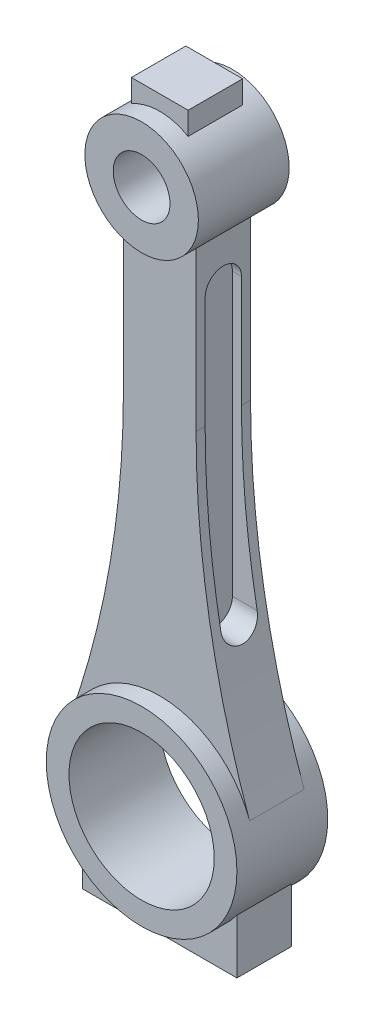
ISO-10303-21;
HEADER;
FILE_DESCRIPTION(('STEP AP214'),'2;1');
FILE_NAME('part.step','',(''),(''),'','','');
FILE_SCHEMA(('AUTOMOTIVE_DESIGN { 1 0 10303 214 1 1 1 1 }'));
ENDSEC;
DATA;
#1=APPLICATION_CONTEXT('core data for automotive mechanical design processes');
#2=APPLICATION_PROTOCOL_DEFINITION('international standard','automotive_design',2000,#1);
#3=PRODUCT_CONTEXT('',#1,'mechanical');
#4=PRODUCT('Part','Part','',(#3));
#5=PRODUCT_RELATED_PRODUCT_CATEGORY('part','',(#4));
#6=PRODUCT_DEFINITION_FORMATION('','',#4);
#7=PRODUCT_DEFINITION_CONTEXT('part definition',#1,'design');
#8=PRODUCT_DEFINITION('design','',#6,#7);
#9=PRODUCT_DEFINITION_SHAPE('','',#8);
#10=(LENGTH_UNIT() NAMED_UNIT(*) SI_UNIT(.MILLI.,.METRE.));
#11=(NAMED_UNIT(*) PLANE_ANGLE_UNIT() SI_UNIT($,.RADIAN.));
#12=(NAMED_UNIT(*) SI_UNIT($,.STERADIAN.) SOLID_ANGLE_UNIT());
#13=UNCERTAINTY_MEASURE_WITH_UNIT(LENGTH_MEASURE(1.E-05),#10,'distance_accuracy_value','');
#14=(GEOMETRIC_REPRESENTATION_CONTEXT(3) GLOBAL_UNCERTAINTY_ASSIGNED_CONTEXT((#13)) GLOBAL_UNIT_ASSIGNED_CONTEXT((#10,
#11,#12)) REPRESENTATION_CONTEXT('',''));
#15=CARTESIAN_POINT('',(0.,0.,0.));
#16=DIRECTION('',(0.,0.,1.));
#17=DIRECTION('',(1.,0.,0.));
#18=AXIS2_PLACEMENT_3D('',#15,#16,#17);
#19=CARTESIAN_POINT('',(212.132819979023,75.3953136438507,6.));
#20=DIRECTION('',(0.,0.,-1.));
#21=DIRECTION('',(-1.,0.,0.));
#22=AXIS2_PLACEMENT_3D('',#19,#20,#21);
#23=CYLINDRICAL_SURFACE('',#22,204.132819979023);
#24=CARTESIAN_POINT('',(11.4544735884215,38.,-4.00000000000002));
#25=CARTESIAN_POINT('',(11.4757515518411,37.8858086335559,-4.00000967356237));
#26=CARTESIAN_POINT('',(11.497127848932,37.7716411229782,-3.9951101211208));
#27=CARTESIAN_POINT('',(11.5399210356049,37.544152772884,-3.97557755361705));
#28=CARTESIAN_POINT('',(11.5613379239584,37.4308319082382,-3.9609448286138));
#29=CARTESIAN_POINT('',(11.6040518019029,37.2058589467753,-3.92203609087539));
#30=CARTESIAN_POINT('',(11.6253488219803,37.0942064124742,-3.89776265395078));
#31=CARTESIAN_POINT('',(11.6676599337569,36.8733657612217,-3.83975872762631));
#32=CARTESIAN_POINT('',(11.688674029376,36.7641776101131,-3.80602836938937));
#33=CARTESIAN_POINT('',(11.7510730473327,36.4413470108117,-3.69089420326939));
#34=CARTESIAN_POINT('',(11.7918289081029,36.2323636826891,-3.59553432969808));
#35=CARTESIAN_POINT('',(11.8702126062764,35.833491871712,-3.37027556179514));
#36=CARTESIAN_POINT('',(11.9078413597511,35.643597793309,-3.24038682968163));
#37=CARTESIAN_POINT('',(11.9784728244352,35.2894796680367,-2.95043691024401));
#38=CARTESIAN_POINT('',(12.0115036519545,35.1250988255321,-2.79057453802656));
#39=CARTESIAN_POINT('',(12.0720036427706,34.8256035029566,-2.44449926104125));
#40=CARTESIAN_POINT('',(12.0994724370194,34.6904909648341,-2.25828460915734));
#41=CARTESIAN_POINT('',(12.1473413477104,34.4559602912754,-1.86832249559897));
#42=CARTESIAN_POINT('',(12.1678582991115,34.3559510460777,-1.66494499104502));
#43=CARTESIAN_POINT('',(12.201667760202,34.1915558050773,-1.24372237948289));
#44=CARTESIAN_POINT('',(12.2149615713729,34.1271633917176,-1.02587988675161));
#45=CARTESIAN_POINT('',(12.2336033492388,34.0369591960168,-0.586274812122712));
#46=CARTESIAN_POINT('',(12.2390950212482,34.0104496060439,-0.364661335561861));
#47=CARTESIAN_POINT('',(12.2423732155319,33.9946184843632,0.0799443502249376));
#48=CARTESIAN_POINT('',(12.2401601145853,34.0052951341723,0.302936491499032));
#49=CARTESIAN_POINT('',(12.2281765408433,34.0632127244266,0.741781925824313));
#50=CARTESIAN_POINT('',(12.2184766498272,34.1101121767816,0.9576823655757));
#51=CARTESIAN_POINT('',(12.1919895794175,34.2385791029979,1.37844153266758));
#52=CARTESIAN_POINT('',(12.1752023313577,34.3201469127454,1.58330015300714));
#53=CARTESIAN_POINT('',(12.1350793834178,34.5159552856904,1.977397761575));
#54=CARTESIAN_POINT('',(12.1117098081664,34.6303649264094,2.16654921549123));
#55=CARTESIAN_POINT('',(12.0593260749273,34.8882465100265,2.52297125984127));
#56=CARTESIAN_POINT('',(12.0303117725959,35.0317191961119,2.69024129055298));
#57=CARTESIAN_POINT('',(11.9671383735568,35.3461665633751,3.00114206510914));
#58=CARTESIAN_POINT('',(11.9329025496515,35.5175545383741,3.14433904981939));
#59=CARTESIAN_POINT('',(11.8607975408038,35.8812712267655,3.40006280722765));
#60=CARTESIAN_POINT('',(11.8229268395298,36.0736086840292,3.51257670427656));
#61=CARTESIAN_POINT('',(11.7440110469991,36.4777513253325,3.70593438635491));
#62=CARTESIAN_POINT('',(11.7029182624971,36.6898643551292,3.78611370956408));
#63=CARTESIAN_POINT('',(11.619535719839,37.1241795414682,3.90944320644274));
#64=CARTESIAN_POINT('',(11.5772477716993,37.3463667203578,3.95264656840454));
#65=CARTESIAN_POINT('',(11.5215540274853,37.6417241762258,3.98457340087694));
#66=CARTESIAN_POINT('',(11.5080944382149,37.713314753212,3.99036111817268));
#67=CARTESIAN_POINT('',(11.4812368188341,37.8565916807734,3.99806924003836));
#68=CARTESIAN_POINT('',(11.467838723541,37.9282776734255,3.99999606757804));
#69=CARTESIAN_POINT('',(11.4544735884215,38.,3.99999999999999));
#70=B_SPLINE_CURVE_WITH_KNOTS('',3,(#24,#25,#26,#27,#28,#29,#30,#31,#32,#33,#34,#35,#36,#37,#38,
#39,#40,#41,#42,#43,#44,#45,#46,#47,#48,#49,#50,#51,#52,#53,#54,#55,#56,#57,#58,#59,#60,#61,#62,
#63,#64,#65,#66,#67,#68,#69),.UNSPECIFIED.,.F.,.F.,(4,2,2,2,2,2,2,2,2,2,2,2,2,2,2,2,2,2,2,2,2,2,
4),(0.,0.348357600629775,0.696704820295753,1.04495903090802,1.39320841164155,2.08947857427321,
2.78554404346984,3.47714614167073,4.1687941135383,4.84816302804556,5.52740949173436,
6.19397531687089,6.86050854603356,7.52083364695975,8.18116514562694,8.84495910470898,
9.50877004017902,10.183492218261,10.8584970981523,11.546741507572,12.2339942357506,
12.4531452672714,12.6719314158043),.UNSPECIFIED.);
#71=CARTESIAN_POINT('',(11.4544735884216,38.,-4.00000000000001));
#72=VERTEX_POINT('',#71);
#73=CARTESIAN_POINT('',(11.4544735884215,38.,3.99999999999999));
#74=VERTEX_POINT('',#73);
#75=EDGE_CURVE('E406',#72,#74,#70,.T.);
#76=ORIENTED_EDGE('',*,*,#75,.T.);
#77=CARTESIAN_POINT('',(212.132819979023,75.3953136438507,4.));
#78=DIRECTION('',(0.,0.,-1.));
#79=DIRECTION('',(0.,1.,0.));
#80=AXIS2_PLACEMENT_3D('',#77,#78,#79);
#81=CIRCLE('',#80,204.132819979023);
#82=CARTESIAN_POINT('',(8.00000000000002,75.3953136438507,4.));
#83=VERTEX_POINT('',#82);
#84=EDGE_CURVE('E257',#74,#83,#81,.T.);
#85=ORIENTED_EDGE('',*,*,#84,.T.);
#86=DIRECTION('',(0.,0.,-1.));
#87=VECTOR('',#86,1.);
#88=CARTESIAN_POINT('',(8.00000000000002,75.3953136438507,6.));
#89=LINE('',#88,#87);
#90=CARTESIAN_POINT('',(8.00000000000002,75.3953136438507,6.));
#91=VERTEX_POINT('',#90);
#92=EDGE_CURVE('E383',#91,#83,#89,.T.);
#93=ORIENTED_EDGE('',*,*,#92,.F.);
#94=CARTESIAN_POINT('',(212.132819979023,75.3953136438507,6.));
#95=DIRECTION('',(0.,0.,1.));
#96=DIRECTION('',(1.,0.,0.));
#97=AXIS2_PLACEMENT_3D('',#94,#95,#96);
#98=CIRCLE('',#97,204.132819979023);
#99=CARTESIAN_POINT('',(19.7873824881445,7.03274443356766,6.));
#100=VERTEX_POINT('',#99);
#101=EDGE_CURVE('E336',#91,#100,#98,.T.);
#102=ORIENTED_EDGE('',*,*,#101,.T.);
#103=DIRECTION('',(0.,0.,-1.));
#104=VECTOR('',#103,1.);
#105=CARTESIAN_POINT('',(19.7873824881444,7.03274443356765,6.));
#106=LINE('',#105,#104);
#107=CARTESIAN_POINT('',(19.7873824881444,7.03274443356765,-6.));
#108=VERTEX_POINT('',#107);
#109=EDGE_CURVE('E352',#100,#108,#106,.T.);
#110=ORIENTED_EDGE('',*,*,#109,.T.);
#111=CARTESIAN_POINT('',(212.132819979023,75.3953136438507,-6.));
#112=DIRECTION('',(0.,0.,1.));
#113=DIRECTION('',(1.,0.,0.));
#114=AXIS2_PLACEMENT_3D('',#111,#112,#113);
#115=CIRCLE('',#114,204.132819979023);
#116=CARTESIAN_POINT('',(8.00000000000002,75.3953136438507,-6.));
#117=VERTEX_POINT('',#116);
#118=EDGE_CURVE('E333',#117,#108,#115,.T.);
#119=ORIENTED_EDGE('',*,*,#118,.F.);
#120=CARTESIAN_POINT('',(8.00000000000002,75.3953136438507,-4.00000000000001));
#121=VERTEX_POINT('',#120);
#122=EDGE_CURVE('E382',#121,#117,#89,.T.);
#123=ORIENTED_EDGE('',*,*,#122,.F.);
#124=CARTESIAN_POINT('',(212.132819979023,75.3953136438507,-4.00000000000001));
#125=DIRECTION('',(0.,0.,1.));
#126=DIRECTION('',(0.,-1.,0.));
#127=AXIS2_PLACEMENT_3D('',#124,#125,#126);
#128=CIRCLE('',#127,204.132819979023);
#129=EDGE_CURVE('E64',#121,#72,#128,.T.);
#130=ORIENTED_EDGE('',*,*,#129,.T.);
#131=EDGE_LOOP('',(#76,#85,#93,#102,#110,#119,#123,#130));
#132=FACE_BOUND('',#131,.T.);
#133=ADVANCED_FACE('F41',(#132),#23,.F.);
#134=CARTESIAN_POINT('',(8.00000000000003,0.,6.));
#135=DIRECTION('',(1.,0.,0.));
#136=DIRECTION('',(0.,1.,0.));
#137=AXIS2_PLACEMENT_3D('',#134,#135,#136);
#138=PLANE('',#137);
#139=ORIENTED_EDGE('',*,*,#92,.T.);
#140=DIRECTION('',(0.,1.,0.));
#141=VECTOR('',#140,1.);
#142=CARTESIAN_POINT('',(8.00000000000003,0.,3.99999999999999));
#143=LINE('',#142,#141);
#144=CARTESIAN_POINT('',(8.00000000000003,100.,4.));
#145=VERTEX_POINT('',#144);
#146=EDGE_CURVE('E403',#83,#145,#143,.T.);
#147=ORIENTED_EDGE('',*,*,#146,.T.);
#148=CARTESIAN_POINT('',(8.00000000000002,100.,0.));
#149=DIRECTION('',(1.,0.,0.));
#150=DIRECTION('',(0.,1.,0.));
#151=AXIS2_PLACEMENT_3D('',#148,#149,#150);
#152=CIRCLE('',#151,4.);
#153=CARTESIAN_POINT('',(8.00000000000003,100.,-4.));
#154=VERTEX_POINT('',#153);
#155=EDGE_CURVE('E400',#145,#154,#152,.F.);
#156=ORIENTED_EDGE('',*,*,#155,.T.);
#157=DIRECTION('',(0.,-1.,0.));
#158=VECTOR('',#157,1.);
#159=CARTESIAN_POINT('',(8.00000000000003,0.,-4.00000000000002));
#160=LINE('',#159,#158);
#161=EDGE_CURVE('E394',#154,#121,#160,.T.);
#162=ORIENTED_EDGE('',*,*,#161,.T.);
#163=ORIENTED_EDGE('',*,*,#122,.T.);
#164=DIRECTION('',(0.,-1.,0.));
#165=VECTOR('',#164,1.);
#166=CARTESIAN_POINT('',(8.00000000000003,0.,-6.));
#167=LINE('',#166,#165);
#168=CARTESIAN_POINT('',(8.00000000000002,110.395313643851,-6.));
#169=VERTEX_POINT('',#168);
#170=EDGE_CURVE('E355',#169,#117,#167,.T.);
#171=ORIENTED_EDGE('',*,*,#170,.F.);
#172=DIRECTION('',(0.,0.,-1.));
#173=VECTOR('',#172,1.);
#174=CARTESIAN_POINT('',(8.00000000000002,110.395313643851,6.));
#175=LINE('',#174,#173);
#176=CARTESIAN_POINT('',(8.00000000000002,110.395313643851,6.));
#177=VERTEX_POINT('',#176);
#178=EDGE_CURVE('E380',#177,#169,#175,.T.);
#179=ORIENTED_EDGE('',*,*,#178,.F.);
#180=DIRECTION('',(0.,-1.,0.));
#181=VECTOR('',#180,1.);
#182=CARTESIAN_POINT('',(8.00000000000003,0.,6.));
#183=LINE('',#182,#181);
#184=EDGE_CURVE('E339',#177,#91,#183,.T.);
#185=ORIENTED_EDGE('',*,*,#184,.T.);
#186=EDGE_LOOP('',(#139,#147,#156,#162,#163,#171,#179,#185));
#187=FACE_BOUND('',#186,.T.);
#188=ADVANCED_FACE('F531',(#187),#138,.T.);
#189=CARTESIAN_POINT('',(0.,0.,10.));
#190=DIRECTION('',(0.,0.,-1.));
#191=DIRECTION('',(-1.,0.,0.));
#192=AXIS2_PLACEMENT_3D('',#189,#190,#191);
#193=CYLINDRICAL_SURFACE('',#192,16.);
#194=CARTESIAN_POINT('',(0.,0.,10.));
#195=DIRECTION('',(0.,0.,1.));
#196=DIRECTION('',(1.,0.,0.));
#197=AXIS2_PLACEMENT_3D('',#194,#195,#196);
#198=CIRCLE('',#197,16.);
#199=CARTESIAN_POINT('',(16.,0.,10.));
#200=VERTEX_POINT('',#199);
#201=EDGE_CURVE('E387',#200,#200,#198,.T.);
#202=ORIENTED_EDGE('',*,*,#201,.T.);
#203=EDGE_LOOP('',(#202));
#204=FACE_BOUND('',#203,.T.);
#205=CARTESIAN_POINT('',(0.,0.,-10.));
#206=DIRECTION('',(0.,0.,1.));
#207=DIRECTION('',(1.,0.,0.));
#208=AXIS2_PLACEMENT_3D('',#205,#206,#207);
#209=CIRCLE('',#208,16.);
#210=CARTESIAN_POINT('',(16.,0.,-10.));
#211=VERTEX_POINT('',#210);
#212=EDGE_CURVE('E386',#211,#211,#209,.T.);
#213=ORIENTED_EDGE('',*,*,#212,.F.);
#214=EDGE_LOOP('',(#213));
#215=FACE_BOUND('',#214,.T.);
#216=ADVANCED_FACE('F43',(#204,#215),#193,.F.);
#217=CARTESIAN_POINT('',(0.,0.,10.));
#218=DIRECTION('',(0.,0.,-1.));
#219=DIRECTION('',(-1.,0.,0.));
#220=AXIS2_PLACEMENT_3D('',#217,#218,#219);
#221=CYLINDRICAL_SURFACE('',#220,21.);
#222=DIRECTION('',(0.,0.,-1.));
#223=VECTOR('',#222,1.);
#224=CARTESIAN_POINT('',(-16.9999999999999,-12.328828005938,6.));
#225=LINE('',#224,#223);
#226=CARTESIAN_POINT('',(-16.9999999999999,-12.328828005938,6.));
#227=VERTEX_POINT('',#226);
#228=CARTESIAN_POINT('',(-16.9999999999999,-12.328828005938,-6.));
#229=VERTEX_POINT('',#228);
#230=EDGE_CURVE('E320',#227,#229,#225,.T.);
#231=ORIENTED_EDGE('',*,*,#230,.F.);
#232=CARTESIAN_POINT('',(0.,0.,6.));
#233=DIRECTION('',(0.,0.,1.));
#234=DIRECTION('',(1.,0.,0.));
#235=AXIS2_PLACEMENT_3D('',#232,#233,#234);
#236=CIRCLE('',#235,21.);
#237=CARTESIAN_POINT('',(16.9610799823413,-12.3823166585507,6.));
#238=VERTEX_POINT('',#237);
#239=EDGE_CURVE('E293',#227,#238,#236,.T.);
#240=ORIENTED_EDGE('',*,*,#239,.T.);
#241=DIRECTION('',(0.,0.,-1.));
#242=VECTOR('',#241,1.);
#243=CARTESIAN_POINT('',(16.9610799823413,-12.3823166585507,6.));
#244=LINE('',#243,#242);
#245=CARTESIAN_POINT('',(16.9610799823413,-12.3823166585507,-6.));
#246=VERTEX_POINT('',#245);
#247=EDGE_CURVE('E304',#238,#246,#244,.T.);
#248=ORIENTED_EDGE('',*,*,#247,.T.);
#249=CARTESIAN_POINT('',(0.,0.,-6.));
#250=DIRECTION('',(0.,0.,1.));
#251=DIRECTION('',(1.,0.,0.));
#252=AXIS2_PLACEMENT_3D('',#249,#250,#251);
#253=CIRCLE('',#252,21.);
#254=EDGE_CURVE('E292',#229,#246,#253,.T.);
#255=ORIENTED_EDGE('',*,*,#254,.F.);
#256=EDGE_LOOP('',(#231,#240,#248,#255));
#257=FACE_BOUND('',#256,.T.);
#258=ORIENTED_EDGE('',*,*,#109,.F.);
#259=CARTESIAN_POINT('',(0.,0.,6.));
#260=DIRECTION('',(0.,0.,1.));
#261=DIRECTION('',(1.,0.,0.));
#262=AXIS2_PLACEMENT_3D('',#259,#260,#261);
#263=CIRCLE('',#262,21.);
#264=CARTESIAN_POINT('',(-19.7873824881443,7.03274443356763,6.));
#265=VERTEX_POINT('',#264);
#266=EDGE_CURVE('E350',#100,#265,#263,.T.);
#267=ORIENTED_EDGE('',*,*,#266,.T.);
#268=DIRECTION('',(0.,0.,-1.));
#269=VECTOR('',#268,1.);
#270=CARTESIAN_POINT('',(-19.7873824881444,7.03274443356765,6.));
#271=LINE('',#270,#269);
#272=CARTESIAN_POINT('',(-19.7873824881444,7.03274443356765,-6.));
#273=VERTEX_POINT('',#272);
#274=EDGE_CURVE('E371',#265,#273,#271,.T.);
#275=ORIENTED_EDGE('',*,*,#274,.T.);
#276=CARTESIAN_POINT('',(0.,0.,-6.));
#277=DIRECTION('',(0.,0.,1.));
#278=DIRECTION('',(1.,0.,0.));
#279=AXIS2_PLACEMENT_3D('',#276,#277,#278);
#280=CIRCLE('',#279,21.);
#281=EDGE_CURVE('E340',#108,#273,#280,.T.);
#282=ORIENTED_EDGE('',*,*,#281,.F.);
#283=EDGE_LOOP('',(#258,#267,#275,#282));
#284=FACE_BOUND('',#283,.T.);
#285=CARTESIAN_POINT('',(0.,0.,10.));
#286=DIRECTION('',(0.,0.,1.));
#287=DIRECTION('',(1.,0.,0.));
#288=AXIS2_PLACEMENT_3D('',#285,#286,#287);
#289=CIRCLE('',#288,21.);
#290=CARTESIAN_POINT('',(21.,0.,10.));
#291=VERTEX_POINT('',#290);
#292=EDGE_CURVE('E390',#291,#291,#289,.T.);
#293=ORIENTED_EDGE('',*,*,#292,.F.);
#294=EDGE_LOOP('',(#293));
#295=FACE_BOUND('',#294,.T.);
#296=CARTESIAN_POINT('',(0.,0.,-10.));
#297=DIRECTION('',(0.,0.,1.));
#298=DIRECTION('',(1.,0.,0.));
#299=AXIS2_PLACEMENT_3D('',#296,#297,#298);
#300=CIRCLE('',#299,21.);
#301=CARTESIAN_POINT('',(21.,0.,-10.));
#302=VERTEX_POINT('',#301);
#303=EDGE_CURVE('E391',#302,#302,#300,.T.);
#304=ORIENTED_EDGE('',*,*,#303,.T.);
#305=EDGE_LOOP('',(#304));
#306=FACE_BOUND('',#305,.T.);
#307=ADVANCED_FACE('F553',(#257,#284,#295,#306),#221,.T.);
#308=CARTESIAN_POINT('',(0.,0.,10.));
#309=DIRECTION('',(0.,0.,1.));
#310=DIRECTION('',(1.,0.,0.));
#311=AXIS2_PLACEMENT_3D('',#308,#309,#310);
#312=PLANE('',#311);
#313=ORIENTED_EDGE('',*,*,#201,.F.);
#314=EDGE_LOOP('',(#313));
#315=FACE_BOUND('',#314,.T.);
#316=ORIENTED_EDGE('',*,*,#292,.T.);
#317=EDGE_LOOP('',(#316));
#318=FACE_BOUND('',#317,.T.);
#319=ADVANCED_FACE('F710',(#315,#318),#312,.T.);
#320=CARTESIAN_POINT('',(0.,0.,-10.));
#321=DIRECTION('',(0.,0.,1.));
#322=DIRECTION('',(1.,0.,0.));
#323=AXIS2_PLACEMENT_3D('',#320,#321,#322);
#324=PLANE('',#323);
#325=ORIENTED_EDGE('',*,*,#212,.T.);
#326=EDGE_LOOP('',(#325));
#327=FACE_BOUND('',#326,.T.);
#328=ORIENTED_EDGE('',*,*,#303,.F.);
#329=EDGE_LOOP('',(#328));
#330=FACE_BOUND('',#329,.T.);
#331=ADVANCED_FACE('F749',(#327,#330),#324,.F.);
#332=CARTESIAN_POINT('',(-7.99999999999997,0.,6.));
#333=DIRECTION('',(1.,0.,0.));
#334=DIRECTION('',(0.,1.,0.));
#335=AXIS2_PLACEMENT_3D('',#332,#333,#334);
#336=PLANE('',#335);
#337=DIRECTION('',(0.,0.,-1.));
#338=VECTOR('',#337,1.);
#339=CARTESIAN_POINT('',(-7.99999999999998,75.3953136438507,6.));
#340=LINE('',#339,#338);
#341=CARTESIAN_POINT('',(-7.99999999999998,75.3953136438507,-4.00000000000001));
#342=VERTEX_POINT('',#341);
#343=CARTESIAN_POINT('',(-7.99999999999998,75.3953136438507,-6.));
#344=VERTEX_POINT('',#343);
#345=EDGE_CURVE('E373',#342,#344,#340,.T.);
#346=ORIENTED_EDGE('',*,*,#345,.F.);
#347=DIRECTION('',(0.,1.,0.));
#348=VECTOR('',#347,1.);
#349=CARTESIAN_POINT('',(-7.99999999999997,0.,-4.00000000000002));
#350=LINE('',#349,#348);
#351=CARTESIAN_POINT('',(-7.99999999999998,100.,-4.));
#352=VERTEX_POINT('',#351);
#353=EDGE_CURVE('E233',#342,#352,#350,.T.);
#354=ORIENTED_EDGE('',*,*,#353,.T.);
#355=CARTESIAN_POINT('',(-7.99999999999998,100.,0.));
#356=DIRECTION('',(1.,0.,0.));
#357=DIRECTION('',(0.,1.,0.));
#358=AXIS2_PLACEMENT_3D('',#355,#356,#357);
#359=CIRCLE('',#358,4.);
#360=CARTESIAN_POINT('',(-7.99999999999998,100.,4.));
#361=VERTEX_POINT('',#360);
#362=EDGE_CURVE('E12',#352,#361,#359,.T.);
#363=ORIENTED_EDGE('',*,*,#362,.T.);
#364=DIRECTION('',(0.,-1.,0.));
#365=VECTOR('',#364,1.);
#366=CARTESIAN_POINT('',(-7.99999999999997,0.,3.99999999999999));
#367=LINE('',#366,#365);
#368=CARTESIAN_POINT('',(-7.99999999999998,75.3953136438507,4.));
#369=VERTEX_POINT('',#368);
#370=EDGE_CURVE('E206',#361,#369,#367,.T.);
#371=ORIENTED_EDGE('',*,*,#370,.T.);
#372=CARTESIAN_POINT('',(-7.99999999999998,75.3953136438507,6.));
#373=VERTEX_POINT('',#372);
#374=EDGE_CURVE('E374',#373,#369,#340,.T.);
#375=ORIENTED_EDGE('',*,*,#374,.F.);
#376=DIRECTION('',(0.,-1.,0.));
#377=VECTOR('',#376,1.);
#378=CARTESIAN_POINT('',(-7.99999999999997,0.,6.));
#379=LINE('',#378,#377);
#380=CARTESIAN_POINT('',(-7.99999999999998,110.395313643851,6.));
#381=VERTEX_POINT('',#380);
#382=EDGE_CURVE('E345',#381,#373,#379,.T.);
#383=ORIENTED_EDGE('',*,*,#382,.F.);
#384=DIRECTION('',(0.,0.,-1.));
#385=VECTOR('',#384,1.);
#386=CARTESIAN_POINT('',(-7.99999999999998,110.395313643851,6.));
#387=LINE('',#386,#385);
#388=CARTESIAN_POINT('',(-7.99999999999998,110.395313643851,-6.));
#389=VERTEX_POINT('',#388);
#390=EDGE_CURVE('E377',#381,#389,#387,.T.);
#391=ORIENTED_EDGE('',*,*,#390,.T.);
#392=DIRECTION('',(0.,-1.,0.));
#393=VECTOR('',#392,1.);
#394=CARTESIAN_POINT('',(-7.99999999999997,0.,-6.));
#395=LINE('',#394,#393);
#396=EDGE_CURVE('E361',#389,#344,#395,.T.);
#397=ORIENTED_EDGE('',*,*,#396,.T.);
#398=EDGE_LOOP('',(#346,#354,#363,#371,#375,#383,#391,#397));
#399=FACE_BOUND('',#398,.T.);
#400=ADVANCED_FACE('F504',(#399),#336,.F.);
#401=CARTESIAN_POINT('',(-212.132819979023,75.3953136438507,6.));
#402=DIRECTION('',(0.,0.,-1.));
#403=DIRECTION('',(-1.,0.,0.));
#404=AXIS2_PLACEMENT_3D('',#401,#402,#403);
#405=CYLINDRICAL_SURFACE('',#404,204.132819979023);
#406=CARTESIAN_POINT('',(-11.4544735884214,38.,3.99999999999999));
#407=CARTESIAN_POINT('',(-11.475751551841,37.8858086335559,4.00000967356234));
#408=CARTESIAN_POINT('',(-11.4971278489319,37.7716411229782,3.99511012112078));
#409=CARTESIAN_POINT('',(-11.5399210356049,37.5441527728839,3.97557755361702));
#410=CARTESIAN_POINT('',(-11.5613379239583,37.4308319082382,3.96094482861378));
#411=CARTESIAN_POINT('',(-11.6040518019029,37.2058589467753,3.92203609087536));
#412=CARTESIAN_POINT('',(-11.6253488219802,37.0942064124742,3.89776265395076));
#413=CARTESIAN_POINT('',(-11.6676599337569,36.8733657612217,3.83975872762629));
#414=CARTESIAN_POINT('',(-11.6886740293759,36.7641776101131,3.80602836938935));
#415=CARTESIAN_POINT('',(-11.7510730473326,36.4413470108117,3.69089420326936));
#416=CARTESIAN_POINT('',(-11.7918289081029,36.2323636826891,3.59553432969805));
#417=CARTESIAN_POINT('',(-11.8702126062764,35.833491871712,3.37027556179511));
#418=CARTESIAN_POINT('',(-11.9078413597511,35.643597793309,3.24038682968161));
#419=CARTESIAN_POINT('',(-11.9784728244352,35.2894796680367,2.95043691024398));
#420=CARTESIAN_POINT('',(-12.0115036519543,35.1250988255321,2.79057453802653));
#421=CARTESIAN_POINT('',(-12.0720036427705,34.8256035029566,2.44449926104121));
#422=CARTESIAN_POINT('',(-12.0994724370193,34.6904909648341,2.25828460915731));
#423=CARTESIAN_POINT('',(-12.1473413477104,34.4559602912754,1.86832249559894));
#424=CARTESIAN_POINT('',(-12.1678582991114,34.3559510460777,1.66494499104498));
#425=CARTESIAN_POINT('',(-12.201667760202,34.1915558050773,1.24372237948285));
#426=CARTESIAN_POINT('',(-12.2149615713728,34.1271633917176,1.02587988675157));
#427=CARTESIAN_POINT('',(-12.2336033492387,34.0369591960168,0.586274812122671));
#428=CARTESIAN_POINT('',(-12.2390950212481,34.0104496060439,0.364661335561822));
#429=CARTESIAN_POINT('',(-12.2423732155318,33.9946184843632,-0.0799443502249733));
#430=CARTESIAN_POINT('',(-12.2401601145853,34.0052951341723,-0.302936491499066));
#431=CARTESIAN_POINT('',(-12.2281765408432,34.0632127244266,-0.741781925824346));
#432=CARTESIAN_POINT('',(-12.2184766498272,34.1101121767816,-0.957682365575734));
#433=CARTESIAN_POINT('',(-12.1919895794175,34.2385791029979,-1.37844153266761));
#434=CARTESIAN_POINT('',(-12.1752023313576,34.3201469127454,-1.58330015300717));
#435=CARTESIAN_POINT('',(-12.1350793834177,34.5159552856904,-1.97739776157503));
#436=CARTESIAN_POINT('',(-12.1117098081663,34.6303649264094,-2.16654921549126));
#437=CARTESIAN_POINT('',(-12.0593260749272,34.8882465100265,-2.5229712598413));
#438=CARTESIAN_POINT('',(-12.0303117725959,35.0317191961119,-2.69024129055301));
#439=CARTESIAN_POINT('',(-11.9671383735568,35.3461665633751,-3.00114206510917));
#440=CARTESIAN_POINT('',(-11.9329025496515,35.5175545383741,-3.14433904981942));
#441=CARTESIAN_POINT('',(-11.8607975408037,35.8812712267655,-3.40006280722767));
#442=CARTESIAN_POINT('',(-11.8229268395297,36.0736086840292,-3.51257670427659));
#443=CARTESIAN_POINT('',(-11.744011046999,36.4777513253325,-3.70593438635494));
#444=CARTESIAN_POINT('',(-11.7029182624971,36.6898643551292,-3.7861137095641));
#445=CARTESIAN_POINT('',(-11.6195357198389,37.1241795414682,-3.90944320644277));
#446=CARTESIAN_POINT('',(-11.5772477716992,37.3463667203578,-3.95264656840457));
#447=CARTESIAN_POINT('',(-11.5215540274852,37.6417241762258,-3.98457340087696));
#448=CARTESIAN_POINT('',(-11.5080944382148,37.7133147532121,-3.99036111817271));
#449=CARTESIAN_POINT('',(-11.4812368188341,37.8565916807734,-3.99806924003839));
#450=CARTESIAN_POINT('',(-11.4678387235409,37.9282776734255,-3.99999606757807));
#451=CARTESIAN_POINT('',(-11.4544735884214,38.,-4.00000000000002));
#452=B_SPLINE_CURVE_WITH_KNOTS('',3,(#406,#407,#408,#409,#410,#411,#412,#413,#414,#415,#416,
#417,#418,#419,#420,#421,#422,#423,#424,#425,#426,#427,#428,#429,#430,#431,#432,#433,#434,#435,
#436,#437,#438,#439,#440,#441,#442,#443,#444,#445,#446,#447,#448,#449,#450,#451),.UNSPECIFIED.,
.F.,.F.,(4,2,2,2,2,2,2,2,2,2,2,2,2,2,2,2,2,2,2,2,2,2,4),(0.,0.348357600629782,0.696704820295757,
1.04495903090802,1.39320841164156,2.08947857427322,2.78554404346984,3.47714614167073,
4.16879411353831,4.84816302804557,5.52740949173437,6.19397531687091,6.86050854603357,
7.52083364695976,8.18116514562695,8.84495910470899,9.50877004017902,10.183492218261,
10.8584970981523,11.546741507572,12.2339942357506,12.4531452672714,12.6719314158043),.UNSPECIFIED.);
#453=CARTESIAN_POINT('',(-11.4544735884215,38.,3.99999999999999));
#454=VERTEX_POINT('',#453);
#455=CARTESIAN_POINT('',(-11.4544735884214,38.,-4.00000000000001));
#456=VERTEX_POINT('',#455);
#457=EDGE_CURVE('E506',#454,#456,#452,.T.);
#458=ORIENTED_EDGE('',*,*,#457,.T.);
#459=CARTESIAN_POINT('',(-212.132819979023,75.3953136438507,-4.00000000000001));
#460=DIRECTION('',(0.,0.,-1.));
#461=DIRECTION('',(0.,1.,0.));
#462=AXIS2_PLACEMENT_3D('',#459,#460,#461);
#463=CIRCLE('',#462,204.132819979023);
#464=EDGE_CURVE('E49',#456,#342,#463,.F.);
#465=ORIENTED_EDGE('',*,*,#464,.T.);
#466=ORIENTED_EDGE('',*,*,#345,.T.);
#467=CARTESIAN_POINT('',(-212.132819979023,75.3953136438507,-6.));
#468=DIRECTION('',(0.,0.,1.));
#469=DIRECTION('',(1.,0.,0.));
#470=AXIS2_PLACEMENT_3D('',#467,#468,#469);
#471=CIRCLE('',#470,204.132819979023);
#472=EDGE_CURVE('E364',#344,#273,#471,.F.);
#473=ORIENTED_EDGE('',*,*,#472,.T.);
#474=ORIENTED_EDGE('',*,*,#274,.F.);
#475=CARTESIAN_POINT('',(-212.132819979023,75.3953136438507,6.));
#476=DIRECTION('',(0.,0.,1.));
#477=DIRECTION('',(1.,0.,0.));
#478=AXIS2_PLACEMENT_3D('',#475,#476,#477);
#479=CIRCLE('',#478,204.132819979023);
#480=EDGE_CURVE('E347',#373,#265,#479,.F.);
#481=ORIENTED_EDGE('',*,*,#480,.F.);
#482=ORIENTED_EDGE('',*,*,#374,.T.);
#483=CARTESIAN_POINT('',(-212.132819979023,75.3953136438507,4.));
#484=DIRECTION('',(0.,0.,1.));
#485=DIRECTION('',(0.,-1.,0.));
#486=AXIS2_PLACEMENT_3D('',#483,#484,#485);
#487=CIRCLE('',#486,204.132819979023);
#488=EDGE_CURVE('E415',#369,#454,#487,.F.);
#489=ORIENTED_EDGE('',*,*,#488,.T.);
#490=EDGE_LOOP('',(#458,#465,#466,#473,#474,#481,#482,#489));
#491=FACE_BOUND('',#490,.T.);
#492=ADVANCED_FACE('F496',(#491),#405,.F.);
#493=CARTESIAN_POINT('',(0.,0.,6.));
#494=DIRECTION('',(0.,0.,1.));
#495=DIRECTION('',(1.,0.,0.));
#496=AXIS2_PLACEMENT_3D('',#493,#494,#495);
#497=PLANE('',#496);
#498=ORIENTED_EDGE('',*,*,#101,.F.);
#499=ORIENTED_EDGE('',*,*,#184,.F.);
#500=CARTESIAN_POINT('',(0.,120.,6.));
#501=DIRECTION('',(0.,0.,1.));
#502=DIRECTION('',(1.,0.,0.));
#503=AXIS2_PLACEMENT_3D('',#500,#501,#502);
#504=CIRCLE('',#503,12.5);
#505=EDGE_CURVE('E343',#381,#177,#504,.T.);
#506=ORIENTED_EDGE('',*,*,#505,.F.);
#507=ORIENTED_EDGE('',*,*,#382,.T.);
#508=ORIENTED_EDGE('',*,*,#480,.T.);
#509=ORIENTED_EDGE('',*,*,#266,.F.);
#510=EDGE_LOOP('',(#498,#499,#506,#507,#508,#509));
#511=FACE_BOUND('',#510,.T.);
#512=ADVANCED_FACE('F493',(#511),#497,.T.);
#513=CARTESIAN_POINT('',(0.,0.,-6.));
#514=DIRECTION('',(0.,0.,1.));
#515=DIRECTION('',(1.,0.,0.));
#516=AXIS2_PLACEMENT_3D('',#513,#514,#515);
#517=PLANE('',#516);
#518=ORIENTED_EDGE('',*,*,#118,.T.);
#519=ORIENTED_EDGE('',*,*,#281,.T.);
#520=ORIENTED_EDGE('',*,*,#472,.F.);
#521=ORIENTED_EDGE('',*,*,#396,.F.);
#522=CARTESIAN_POINT('',(0.,120.,-6.));
#523=DIRECTION('',(0.,0.,1.));
#524=DIRECTION('',(1.,0.,0.));
#525=AXIS2_PLACEMENT_3D('',#522,#523,#524);
#526=CIRCLE('',#525,12.5);
#527=EDGE_CURVE('E358',#389,#169,#526,.T.);
#528=ORIENTED_EDGE('',*,*,#527,.T.);
#529=ORIENTED_EDGE('',*,*,#170,.T.);
#530=EDGE_LOOP('',(#518,#519,#520,#521,#528,#529));
#531=FACE_BOUND('',#530,.T.);
#532=ADVANCED_FACE('F488',(#531),#517,.F.);
#533=CARTESIAN_POINT('',(0.,120.,10.));
#534=DIRECTION('',(0.,0.,1.));
#535=DIRECTION('',(1.,0.,0.));
#536=AXIS2_PLACEMENT_3D('',#533,#534,#535);
#537=PLANE('',#536);
#538=CARTESIAN_POINT('',(0.,120.,10.));
#539=DIRECTION('',(0.,0.,1.));
#540=DIRECTION('',(1.,0.,0.));
#541=AXIS2_PLACEMENT_3D('',#538,#539,#540);
#542=CIRCLE('',#541,12.5);
#543=CARTESIAN_POINT('',(12.5,120.,10.));
#544=VERTEX_POINT('',#543);
#545=EDGE_CURVE('E323',#544,#544,#542,.T.);
#546=ORIENTED_EDGE('',*,*,#545,.T.);
#547=EDGE_LOOP('',(#546));
#548=FACE_BOUND('',#547,.T.);
#549=CARTESIAN_POINT('',(0.,120.,10.));
#550=DIRECTION('',(0.,0.,1.));
#551=DIRECTION('',(1.,0.,0.));
#552=AXIS2_PLACEMENT_3D('',#549,#550,#551);
#553=CIRCLE('',#552,6.25000000000001);
#554=CARTESIAN_POINT('',(6.25000000000001,120.,10.));
#555=VERTEX_POINT('',#554);
#556=EDGE_CURVE('E327',#555,#555,#553,.T.);
#557=ORIENTED_EDGE('',*,*,#556,.F.);
#558=EDGE_LOOP('',(#557));
#559=FACE_BOUND('',#558,.T.);
#560=ADVANCED_FACE('F484',(#548,#559),#537,.T.);
#561=CARTESIAN_POINT('',(0.,120.,-10.));
#562=DIRECTION('',(0.,0.,1.));
#563=DIRECTION('',(1.,0.,0.));
#564=AXIS2_PLACEMENT_3D('',#561,#562,#563);
#565=PLANE('',#564);
#566=CARTESIAN_POINT('',(0.,120.,-10.));
#567=DIRECTION('',(0.,0.,1.));
#568=DIRECTION('',(1.,0.,0.));
#569=AXIS2_PLACEMENT_3D('',#566,#567,#568);
#570=CIRCLE('',#569,12.5);
#571=CARTESIAN_POINT('',(12.5,120.,-10.));
#572=VERTEX_POINT('',#571);
#573=EDGE_CURVE('E324',#572,#572,#570,.T.);
#574=ORIENTED_EDGE('',*,*,#573,.F.);
#575=EDGE_LOOP('',(#574));
#576=FACE_BOUND('',#575,.T.);
#577=CARTESIAN_POINT('',(0.,120.,-10.));
#578=DIRECTION('',(0.,0.,1.));
#579=DIRECTION('',(1.,0.,0.));
#580=AXIS2_PLACEMENT_3D('',#577,#578,#579);
#581=CIRCLE('',#580,6.25000000000001);
#582=CARTESIAN_POINT('',(6.25000000000001,120.,-10.));
#583=VERTEX_POINT('',#582);
#584=EDGE_CURVE('E330',#583,#583,#581,.T.);
#585=ORIENTED_EDGE('',*,*,#584,.T.);
#586=EDGE_LOOP('',(#585));
#587=FACE_BOUND('',#586,.T.);
#588=ADVANCED_FACE('F480',(#576,#587),#565,.F.);
#589=CARTESIAN_POINT('',(0.,120.,10.));
#590=DIRECTION('',(0.,0.,-1.));
#591=DIRECTION('',(-1.,0.,0.));
#592=AXIS2_PLACEMENT_3D('',#589,#590,#591);
#593=CYLINDRICAL_SURFACE('',#592,12.5);
#594=DIRECTION('',(0.,0.,-1.));
#595=VECTOR('',#594,1.);
#596=CARTESIAN_POINT('',(6.25,130.825317547305,6.));
#597=LINE('',#596,#595);
#598=CARTESIAN_POINT('',(6.25,130.825317547305,6.));
#599=VERTEX_POINT('',#598);
#600=CARTESIAN_POINT('',(6.25,130.825317547305,-6.));
#601=VERTEX_POINT('',#600);
#602=EDGE_CURVE('E289',#599,#601,#597,.T.);
#603=ORIENTED_EDGE('',*,*,#602,.F.);
#604=CARTESIAN_POINT('',(0.,120.,6.));
#605=DIRECTION('',(0.,0.,1.));
#606=DIRECTION('',(1.,0.,0.));
#607=AXIS2_PLACEMENT_3D('',#604,#605,#606);
#608=CIRCLE('',#607,12.5);
#609=CARTESIAN_POINT('',(-6.25,130.825317547305,6.));
#610=VERTEX_POINT('',#609);
#611=EDGE_CURVE('E261',#599,#610,#608,.T.);
#612=ORIENTED_EDGE('',*,*,#611,.T.);
#613=DIRECTION('',(0.,0.,-1.));
#614=VECTOR('',#613,1.);
#615=CARTESIAN_POINT('',(-6.25,130.825317547305,6.));
#616=LINE('',#615,#614);
#617=CARTESIAN_POINT('',(-6.25,130.825317547305,-6.));
#618=VERTEX_POINT('',#617);
#619=EDGE_CURVE('E273',#610,#618,#616,.T.);
#620=ORIENTED_EDGE('',*,*,#619,.T.);
#621=CARTESIAN_POINT('',(0.,120.,-6.));
#622=DIRECTION('',(0.,0.,1.));
#623=DIRECTION('',(1.,0.,0.));
#624=AXIS2_PLACEMENT_3D('',#621,#622,#623);
#625=CIRCLE('',#624,12.5);
#626=EDGE_CURVE('E260',#601,#618,#625,.T.);
#627=ORIENTED_EDGE('',*,*,#626,.F.);
#628=EDGE_LOOP('',(#603,#612,#620,#627));
#629=FACE_BOUND('',#628,.T.);
#630=ORIENTED_EDGE('',*,*,#505,.T.);
#631=ORIENTED_EDGE('',*,*,#178,.T.);
#632=ORIENTED_EDGE('',*,*,#527,.F.);
#633=ORIENTED_EDGE('',*,*,#390,.F.);
#634=EDGE_LOOP('',(#630,#631,#632,#633));
#635=FACE_BOUND('',#634,.T.);
#636=ORIENTED_EDGE('',*,*,#545,.F.);
#637=EDGE_LOOP('',(#636));
#638=FACE_BOUND('',#637,.T.);
#639=ORIENTED_EDGE('',*,*,#573,.T.);
#640=EDGE_LOOP('',(#639));
#641=FACE_BOUND('',#640,.T.);
#642=ADVANCED_FACE('F477',(#629,#635,#638,#641),#593,.T.);
#643=CARTESIAN_POINT('',(0.,120.,10.));
#644=DIRECTION('',(0.,0.,-1.));
#645=DIRECTION('',(-1.,0.,0.));
#646=AXIS2_PLACEMENT_3D('',#643,#644,#645);
#647=CYLINDRICAL_SURFACE('',#646,6.25000000000001);
#648=ORIENTED_EDGE('',*,*,#556,.T.);
#649=EDGE_LOOP('',(#648));
#650=FACE_BOUND('',#649,.T.);
#651=ORIENTED_EDGE('',*,*,#584,.F.);
#652=EDGE_LOOP('',(#651));
#653=FACE_BOUND('',#652,.T.);
#654=ADVANCED_FACE('F475',(#650,#653),#647,.F.);
#655=CARTESIAN_POINT('',(-16.9999999999999,0.,6.));
#656=DIRECTION('',(-1.,0.,0.));
#657=DIRECTION('',(0.,0.,1.));
#658=AXIS2_PLACEMENT_3D('',#655,#656,#657);
#659=PLANE('',#658);
#660=DIRECTION('',(0.,1.,0.));
#661=VECTOR('',#660,1.);
#662=CARTESIAN_POINT('',(-16.9999999999999,0.,-6.));
#663=LINE('',#662,#661);
#664=CARTESIAN_POINT('',(-16.9999999999999,-24.328828005938,-6.));
#665=VERTEX_POINT('',#664);
#666=EDGE_CURVE('E307',#665,#229,#663,.T.);
#667=ORIENTED_EDGE('',*,*,#666,.F.);
#668=DIRECTION('',(0.,0.,-1.));
#669=VECTOR('',#668,1.);
#670=CARTESIAN_POINT('',(-16.9999999999999,-24.328828005938,6.));
#671=LINE('',#670,#669);
#672=CARTESIAN_POINT('',(-16.9999999999999,-24.328828005938,6.));
#673=VERTEX_POINT('',#672);
#674=EDGE_CURVE('E318',#673,#665,#671,.T.);
#675=ORIENTED_EDGE('',*,*,#674,.F.);
#676=DIRECTION('',(0.,1.,0.));
#677=VECTOR('',#676,1.);
#678=CARTESIAN_POINT('',(-16.9999999999999,0.,6.));
#679=LINE('',#678,#677);
#680=EDGE_CURVE('E295',#673,#227,#679,.T.);
#681=ORIENTED_EDGE('',*,*,#680,.T.);
#682=ORIENTED_EDGE('',*,*,#230,.T.);
#683=EDGE_LOOP('',(#667,#675,#681,#682));
#684=FACE_BOUND('',#683,.T.);
#685=ADVANCED_FACE('F471',(#684),#659,.T.);
#686=CARTESIAN_POINT('',(0.,-24.328828005938,6.));
#687=DIRECTION('',(0.,1.,0.));
#688=DIRECTION('',(-1.,0.,0.));
#689=AXIS2_PLACEMENT_3D('',#686,#687,#688);
#690=PLANE('',#689);
#691=DIRECTION('',(1.,0.,0.));
#692=VECTOR('',#691,1.);
#693=CARTESIAN_POINT('',(0.,-24.328828005938,-6.));
#694=LINE('',#693,#692);
#695=CARTESIAN_POINT('',(17.0000000000001,-24.328828005938,-6.));
#696=VERTEX_POINT('',#695);
#697=EDGE_CURVE('E310',#665,#696,#694,.T.);
#698=ORIENTED_EDGE('',*,*,#697,.T.);
#699=DIRECTION('',(0.,0.,-1.));
#700=VECTOR('',#699,1.);
#701=CARTESIAN_POINT('',(17.0000000000001,-24.328828005938,6.));
#702=LINE('',#701,#700);
#703=CARTESIAN_POINT('',(17.0000000000001,-24.328828005938,6.));
#704=VERTEX_POINT('',#703);
#705=EDGE_CURVE('E315',#704,#696,#702,.T.);
#706=ORIENTED_EDGE('',*,*,#705,.F.);
#707=DIRECTION('',(1.,0.,0.));
#708=VECTOR('',#707,1.);
#709=CARTESIAN_POINT('',(0.,-24.328828005938,6.));
#710=LINE('',#709,#708);
#711=EDGE_CURVE('E299',#673,#704,#710,.T.);
#712=ORIENTED_EDGE('',*,*,#711,.F.);
#713=ORIENTED_EDGE('',*,*,#674,.T.);
#714=EDGE_LOOP('',(#698,#706,#712,#713));
#715=FACE_BOUND('',#714,.T.);
#716=ADVANCED_FACE('F467',(#715),#690,.F.);
#717=CARTESIAN_POINT('',(16.9205605850555,0.0551247554718871,6.));
#718=DIRECTION('',(-0.999994693228297,-0.00325783904500667,0.));
#719=DIRECTION('',(0.00325783904500667,-0.999994693228298,0.));
#720=AXIS2_PLACEMENT_3D('',#717,#718,#719);
#721=PLANE('',#720);
#722=DIRECTION('',(-0.00325783904500667,0.999994693228298,0.));
#723=VECTOR('',#722,1.);
#724=CARTESIAN_POINT('',(16.9205605850555,0.0551247554718871,-6.));
#725=LINE('',#724,#723);
#726=EDGE_CURVE('E296',#696,#246,#725,.T.);
#727=ORIENTED_EDGE('',*,*,#726,.T.);
#728=ORIENTED_EDGE('',*,*,#247,.F.);
#729=DIRECTION('',(-0.00325783904500667,0.999994693228298,0.));
#730=VECTOR('',#729,1.);
#731=CARTESIAN_POINT('',(16.9205605850555,0.0551247554718871,6.));
#732=LINE('',#731,#730);
#733=EDGE_CURVE('E301',#704,#238,#732,.T.);
#734=ORIENTED_EDGE('',*,*,#733,.F.);
#735=ORIENTED_EDGE('',*,*,#705,.T.);
#736=EDGE_LOOP('',(#727,#728,#734,#735));
#737=FACE_BOUND('',#736,.T.);
#738=ADVANCED_FACE('F460',(#737),#721,.F.);
#739=CARTESIAN_POINT('',(0.,0.,6.));
#740=DIRECTION('',(0.,0.,1.));
#741=DIRECTION('',(1.,0.,0.));
#742=AXIS2_PLACEMENT_3D('',#739,#740,#741);
#743=PLANE('',#742);
#744=ORIENTED_EDGE('',*,*,#239,.F.);
#745=ORIENTED_EDGE('',*,*,#680,.F.);
#746=ORIENTED_EDGE('',*,*,#711,.T.);
#747=ORIENTED_EDGE('',*,*,#733,.T.);
#748=EDGE_LOOP('',(#744,#745,#746,#747));
#749=FACE_BOUND('',#748,.T.);
#750=ADVANCED_FACE('F457',(#749),#743,.T.);
#751=CARTESIAN_POINT('',(0.,0.,-6.));
#752=DIRECTION('',(0.,0.,1.));
#753=DIRECTION('',(1.,0.,0.));
#754=AXIS2_PLACEMENT_3D('',#751,#752,#753);
#755=PLANE('',#754);
#756=ORIENTED_EDGE('',*,*,#254,.T.);
#757=ORIENTED_EDGE('',*,*,#726,.F.);
#758=ORIENTED_EDGE('',*,*,#697,.F.);
#759=ORIENTED_EDGE('',*,*,#666,.T.);
#760=EDGE_LOOP('',(#756,#757,#758,#759));
#761=FACE_BOUND('',#760,.T.);
#762=ADVANCED_FACE('F455',(#761),#755,.F.);
#763=CARTESIAN_POINT('',(6.25000000000011,0.,6.));
#764=DIRECTION('',(1.,0.,0.));
#765=DIRECTION('',(0.,1.,0.));
#766=AXIS2_PLACEMENT_3D('',#763,#764,#765);
#767=PLANE('',#766);
#768=DIRECTION('',(0.,-1.,0.));
#769=VECTOR('',#768,1.);
#770=CARTESIAN_POINT('',(6.25000000000011,0.,-6.));
#771=LINE('',#770,#769);
#772=CARTESIAN_POINT('',(6.25,135.825317547305,-6.));
#773=VERTEX_POINT('',#772);
#774=EDGE_CURVE('E276',#773,#601,#771,.T.);
#775=ORIENTED_EDGE('',*,*,#774,.F.);
#776=DIRECTION('',(0.,0.,-1.));
#777=VECTOR('',#776,1.);
#778=CARTESIAN_POINT('',(6.25,135.825317547305,6.));
#779=LINE('',#778,#777);
#780=CARTESIAN_POINT('',(6.25,135.825317547305,6.));
#781=VERTEX_POINT('',#780);
#782=EDGE_CURVE('E287',#781,#773,#779,.T.);
#783=ORIENTED_EDGE('',*,*,#782,.F.);
#784=DIRECTION('',(0.,-1.,0.));
#785=VECTOR('',#784,1.);
#786=CARTESIAN_POINT('',(6.25000000000011,0.,6.));
#787=LINE('',#786,#785);
#788=EDGE_CURVE('E263',#781,#599,#787,.T.);
#789=ORIENTED_EDGE('',*,*,#788,.T.);
#790=ORIENTED_EDGE('',*,*,#602,.T.);
#791=EDGE_LOOP('',(#775,#783,#789,#790));
#792=FACE_BOUND('',#791,.T.);
#793=ADVANCED_FACE('F451',(#792),#767,.T.);
#794=CARTESIAN_POINT('',(0.,135.825317547305,6.));
#795=DIRECTION('',(0.,1.,0.));
#796=DIRECTION('',(0.,0.,1.));
#797=AXIS2_PLACEMENT_3D('',#794,#795,#796);
#798=PLANE('',#797);
#799=DIRECTION('',(1.,0.,0.));
#800=VECTOR('',#799,1.);
#801=CARTESIAN_POINT('',(0.,135.825317547305,-6.));
#802=LINE('',#801,#800);
#803=CARTESIAN_POINT('',(-6.25,135.825317547305,-6.));
#804=VERTEX_POINT('',#803);
#805=EDGE_CURVE('E279',#804,#773,#802,.T.);
#806=ORIENTED_EDGE('',*,*,#805,.F.);
#807=DIRECTION('',(0.,0.,-1.));
#808=VECTOR('',#807,1.);
#809=CARTESIAN_POINT('',(-6.25,135.825317547305,6.));
#810=LINE('',#809,#808);
#811=CARTESIAN_POINT('',(-6.25,135.825317547305,6.));
#812=VERTEX_POINT('',#811);
#813=EDGE_CURVE('E285',#812,#804,#810,.T.);
#814=ORIENTED_EDGE('',*,*,#813,.F.);
#815=DIRECTION('',(1.,0.,0.));
#816=VECTOR('',#815,1.);
#817=CARTESIAN_POINT('',(0.,135.825317547305,6.));
#818=LINE('',#817,#816);
#819=EDGE_CURVE('E267',#812,#781,#818,.T.);
#820=ORIENTED_EDGE('',*,*,#819,.T.);
#821=ORIENTED_EDGE('',*,*,#782,.T.);
#822=EDGE_LOOP('',(#806,#814,#820,#821));
#823=FACE_BOUND('',#822,.T.);
#824=ADVANCED_FACE('F447',(#823),#798,.T.);
#825=CARTESIAN_POINT('',(-6.24999999999991,0.,6.));
#826=DIRECTION('',(1.,0.,0.));
#827=DIRECTION('',(0.,1.,0.));
#828=AXIS2_PLACEMENT_3D('',#825,#826,#827);
#829=PLANE('',#828);
#830=DIRECTION('',(0.,-1.,0.));
#831=VECTOR('',#830,1.);
#832=CARTESIAN_POINT('',(-6.24999999999991,0.,-6.));
#833=LINE('',#832,#831);
#834=EDGE_CURVE('E264',#804,#618,#833,.T.);
#835=ORIENTED_EDGE('',*,*,#834,.T.);
#836=ORIENTED_EDGE('',*,*,#619,.F.);
#837=DIRECTION('',(0.,-1.,0.));
#838=VECTOR('',#837,1.);
#839=CARTESIAN_POINT('',(-6.24999999999991,0.,6.));
#840=LINE('',#839,#838);
#841=EDGE_CURVE('E270',#812,#610,#840,.T.);
#842=ORIENTED_EDGE('',*,*,#841,.F.);
#843=ORIENTED_EDGE('',*,*,#813,.T.);
#844=EDGE_LOOP('',(#835,#836,#842,#843));
#845=FACE_BOUND('',#844,.T.);
#846=ADVANCED_FACE('F440',(#845),#829,.F.);
#847=CARTESIAN_POINT('',(0.,0.,6.));
#848=DIRECTION('',(0.,0.,1.));
#849=DIRECTION('',(1.,0.,0.));
#850=AXIS2_PLACEMENT_3D('',#847,#848,#849);
#851=PLANE('',#850);
#852=ORIENTED_EDGE('',*,*,#611,.F.);
#853=ORIENTED_EDGE('',*,*,#788,.F.);
#854=ORIENTED_EDGE('',*,*,#819,.F.);
#855=ORIENTED_EDGE('',*,*,#841,.T.);
#856=EDGE_LOOP('',(#852,#853,#854,#855));
#857=FACE_BOUND('',#856,.T.);
#858=ADVANCED_FACE('F437',(#857),#851,.T.);
#859=CARTESIAN_POINT('',(0.,0.,-6.));
#860=DIRECTION('',(0.,0.,1.));
#861=DIRECTION('',(1.,0.,0.));
#862=AXIS2_PLACEMENT_3D('',#859,#860,#861);
#863=PLANE('',#862);
#864=ORIENTED_EDGE('',*,*,#626,.T.);
#865=ORIENTED_EDGE('',*,*,#834,.F.);
#866=ORIENTED_EDGE('',*,*,#805,.T.);
#867=ORIENTED_EDGE('',*,*,#774,.T.);
#868=EDGE_LOOP('',(#864,#865,#866,#867));
#869=FACE_BOUND('',#868,.T.);
#870=ADVANCED_FACE('F435',(#869),#863,.F.);
#871=CARTESIAN_POINT('',(21.,100.,0.));
#872=DIRECTION('',(-1.,0.,0.));
#873=DIRECTION('',(0.,0.,1.));
#874=AXIS2_PLACEMENT_3D('',#871,#872,#873);
#875=CYLINDRICAL_SURFACE('',#874,4.);
#876=DIRECTION('',(-1.,0.,0.));
#877=VECTOR('',#876,1.);
#878=CARTESIAN_POINT('',(21.,100.,4.));
#879=LINE('',#878,#877);
#880=CARTESIAN_POINT('',(6.,100.,4.));
#881=VERTEX_POINT('',#880);
#882=EDGE_CURVE('E254',#145,#881,#879,.T.);
#883=ORIENTED_EDGE('',*,*,#882,.T.);
#884=CARTESIAN_POINT('',(6.,100.,0.));
#885=DIRECTION('',(1.,0.,0.));
#886=DIRECTION('',(0.,0.,-1.));
#887=AXIS2_PLACEMENT_3D('',#884,#885,#886);
#888=CIRCLE('',#887,4.);
#889=CARTESIAN_POINT('',(6.,100.,-4.));
#890=VERTEX_POINT('',#889);
#891=EDGE_CURVE('E236',#890,#881,#888,.T.);
#892=ORIENTED_EDGE('',*,*,#891,.F.);
#893=DIRECTION('',(-1.,0.,0.));
#894=VECTOR('',#893,1.);
#895=CARTESIAN_POINT('',(21.,100.,-4.));
#896=LINE('',#895,#894);
#897=EDGE_CURVE('E248',#154,#890,#896,.T.);
#898=ORIENTED_EDGE('',*,*,#897,.F.);
#899=ORIENTED_EDGE('',*,*,#155,.F.);
#900=EDGE_LOOP('',(#883,#892,#898,#899));
#901=FACE_BOUND('',#900,.T.);
#902=ADVANCED_FACE('F431',(#901),#875,.F.);
#903=CARTESIAN_POINT('',(21.,100.,4.));
#904=DIRECTION('',(0.,0.,-1.));
#905=DIRECTION('',(0.,1.,0.));
#906=AXIS2_PLACEMENT_3D('',#903,#904,#905);
#907=PLANE('',#906);
#908=DIRECTION('',(-1.,0.,0.));
#909=VECTOR('',#908,1.);
#910=CARTESIAN_POINT('',(21.,38.,3.99999999999999));
#911=LINE('',#910,#909);
#912=CARTESIAN_POINT('',(6.,38.,3.99999999999999));
#913=VERTEX_POINT('',#912);
#914=EDGE_CURVE('E252',#74,#913,#911,.T.);
#915=ORIENTED_EDGE('',*,*,#914,.T.);
#916=DIRECTION('',(0.,-1.,0.));
#917=VECTOR('',#916,1.);
#918=CARTESIAN_POINT('',(6.,100.,4.));
#919=LINE('',#918,#917);
#920=EDGE_CURVE('E239',#881,#913,#919,.T.);
#921=ORIENTED_EDGE('',*,*,#920,.F.);
#922=ORIENTED_EDGE('',*,*,#882,.F.);
#923=ORIENTED_EDGE('',*,*,#146,.F.);
#924=ORIENTED_EDGE('',*,*,#84,.F.);
#925=EDGE_LOOP('',(#915,#921,#922,#923,#924));
#926=FACE_BOUND('',#925,.T.);
#927=ADVANCED_FACE('F426',(#926),#907,.T.);
#928=CARTESIAN_POINT('',(21.,38.,0.));
#929=DIRECTION('',(-1.,0.,0.));
#930=DIRECTION('',(0.,0.,1.));
#931=AXIS2_PLACEMENT_3D('',#928,#929,#930);
#932=CYLINDRICAL_SURFACE('',#931,4.);
#933=DIRECTION('',(-1.,0.,0.));
#934=VECTOR('',#933,1.);
#935=CARTESIAN_POINT('',(21.,38.,-4.00000000000001));
#936=LINE('',#935,#934);
#937=CARTESIAN_POINT('',(6.,38.,-4.00000000000001));
#938=VERTEX_POINT('',#937);
#939=EDGE_CURVE('E250',#72,#938,#936,.T.);
#940=ORIENTED_EDGE('',*,*,#939,.T.);
#941=CARTESIAN_POINT('',(6.,38.,0.));
#942=DIRECTION('',(1.,0.,0.));
#943=DIRECTION('',(0.,0.,-1.));
#944=AXIS2_PLACEMENT_3D('',#941,#942,#943);
#945=CIRCLE('',#944,4.);
#946=EDGE_CURVE('E242',#913,#938,#945,.T.);
#947=ORIENTED_EDGE('',*,*,#946,.F.);
#948=ORIENTED_EDGE('',*,*,#914,.F.);
#949=ORIENTED_EDGE('',*,*,#75,.F.);
#950=EDGE_LOOP('',(#940,#947,#948,#949));
#951=FACE_BOUND('',#950,.T.);
#952=ADVANCED_FACE('F420',(#951),#932,.F.);
#953=CARTESIAN_POINT('',(21.,100.,-4.));
#954=DIRECTION('',(0.,0.,1.));
#955=DIRECTION('',(0.,-1.,0.));
#956=AXIS2_PLACEMENT_3D('',#953,#954,#955);
#957=PLANE('',#956);
#958=ORIENTED_EDGE('',*,*,#161,.F.);
#959=ORIENTED_EDGE('',*,*,#897,.T.);
#960=DIRECTION('',(0.,1.,0.));
#961=VECTOR('',#960,1.);
#962=CARTESIAN_POINT('',(6.,100.,-4.));
#963=LINE('',#962,#961);
#964=EDGE_CURVE('E245',#938,#890,#963,.T.);
#965=ORIENTED_EDGE('',*,*,#964,.F.);
#966=ORIENTED_EDGE('',*,*,#939,.F.);
#967=ORIENTED_EDGE('',*,*,#129,.F.);
#968=EDGE_LOOP('',(#958,#959,#965,#966,#967));
#969=FACE_BOUND('',#968,.T.);
#970=ADVANCED_FACE('F425',(#969),#957,.T.);
#971=CARTESIAN_POINT('',(6.,100.,0.));
#972=DIRECTION('',(1.,0.,0.));
#973=DIRECTION('',(0.,0.,-1.));
#974=AXIS2_PLACEMENT_3D('',#971,#972,#973);
#975=PLANE('',#974);
#976=ORIENTED_EDGE('',*,*,#891,.T.);
#977=ORIENTED_EDGE('',*,*,#920,.T.);
#978=ORIENTED_EDGE('',*,*,#946,.T.);
#979=ORIENTED_EDGE('',*,*,#964,.T.);
#980=EDGE_LOOP('',(#976,#977,#978,#979));
#981=FACE_BOUND('',#980,.T.);
#982=ADVANCED_FACE('F524',(#981),#975,.T.);
#983=CARTESIAN_POINT('',(-21.,100.,0.));
#984=DIRECTION('',(1.,0.,0.));
#985=DIRECTION('',(0.,0.,-1.));
#986=AXIS2_PLACEMENT_3D('',#983,#984,#985);
#987=CYLINDRICAL_SURFACE('',#986,4.);
#988=DIRECTION('',(1.,0.,0.));
#989=VECTOR('',#988,1.);
#990=CARTESIAN_POINT('',(-21.,100.,-4.));
#991=LINE('',#990,#989);
#992=CARTESIAN_POINT('',(-6.,100.,-4.));
#993=VERTEX_POINT('',#992);
#994=EDGE_CURVE('E223',#352,#993,#991,.T.);
#995=ORIENTED_EDGE('',*,*,#994,.T.);
#996=CARTESIAN_POINT('',(-6.,100.,0.));
#997=DIRECTION('',(1.,0.,0.));
#998=DIRECTION('',(0.,0.,-1.));
#999=AXIS2_PLACEMENT_3D('',#996,#997,#998);
#1000=CIRCLE('',#999,4.);
#1001=CARTESIAN_POINT('',(-6.,100.,4.));
#1002=VERTEX_POINT('',#1001);
#1003=EDGE_CURVE('E216',#993,#1002,#1000,.T.);
#1004=ORIENTED_EDGE('',*,*,#1003,.T.);
#1005=DIRECTION('',(1.,0.,0.));
#1006=VECTOR('',#1005,1.);
#1007=CARTESIAN_POINT('',(-21.,100.,4.));
#1008=LINE('',#1007,#1006);
#1009=EDGE_CURVE('E201',#361,#1002,#1008,.T.);
#1010=ORIENTED_EDGE('',*,*,#1009,.F.);
#1011=ORIENTED_EDGE('',*,*,#362,.F.);
#1012=EDGE_LOOP('',(#995,#1004,#1010,#1011));
#1013=FACE_BOUND('',#1012,.T.);
#1014=ADVANCED_FACE('F221',(#1013),#987,.F.);
#1015=CARTESIAN_POINT('',(-21.,100.,-4.));
#1016=DIRECTION('',(0.,0.,-1.));
#1017=DIRECTION('',(0.,1.,0.));
#1018=AXIS2_PLACEMENT_3D('',#1015,#1016,#1017);
#1019=PLANE('',#1018);
#1020=ORIENTED_EDGE('',*,*,#464,.F.);
#1021=DIRECTION('',(1.,0.,0.));
#1022=VECTOR('',#1021,1.);
#1023=CARTESIAN_POINT('',(-21.,38.,-4.00000000000001));
#1024=LINE('',#1023,#1022);
#1025=CARTESIAN_POINT('',(-6.,38.,-4.00000000000001));
#1026=VERTEX_POINT('',#1025);
#1027=EDGE_CURVE('E229',#456,#1026,#1024,.T.);
#1028=ORIENTED_EDGE('',*,*,#1027,.T.);
#1029=DIRECTION('',(0.,1.,0.));
#1030=VECTOR('',#1029,1.);
#1031=CARTESIAN_POINT('',(-6.,100.,-4.));
#1032=LINE('',#1031,#1030);
#1033=EDGE_CURVE('E209',#1026,#993,#1032,.T.);
#1034=ORIENTED_EDGE('',*,*,#1033,.T.);
#1035=ORIENTED_EDGE('',*,*,#994,.F.);
#1036=ORIENTED_EDGE('',*,*,#353,.F.);
#1037=EDGE_LOOP('',(#1020,#1028,#1034,#1035,#1036));
#1038=FACE_BOUND('',#1037,.T.);
#1039=ADVANCED_FACE('F518',(#1038),#1019,.F.);
#1040=CARTESIAN_POINT('',(-21.,38.,0.));
#1041=DIRECTION('',(1.,0.,0.));
#1042=DIRECTION('',(0.,0.,-1.));
#1043=AXIS2_PLACEMENT_3D('',#1040,#1041,#1042);
#1044=CYLINDRICAL_SURFACE('',#1043,4.);
#1045=DIRECTION('',(1.,0.,0.));
#1046=VECTOR('',#1045,1.);
#1047=CARTESIAN_POINT('',(-21.,38.,3.99999999999999));
#1048=LINE('',#1047,#1046);
#1049=CARTESIAN_POINT('',(-6.,38.,3.99999999999999));
#1050=VERTEX_POINT('',#1049);
#1051=EDGE_CURVE('E56',#454,#1050,#1048,.T.);
#1052=ORIENTED_EDGE('',*,*,#1051,.T.);
#1053=CARTESIAN_POINT('',(-6.,38.,0.));
#1054=DIRECTION('',(1.,0.,0.));
#1055=DIRECTION('',(0.,0.,-1.));
#1056=AXIS2_PLACEMENT_3D('',#1053,#1054,#1055);
#1057=CIRCLE('',#1056,4.);
#1058=EDGE_CURVE('E219',#1050,#1026,#1057,.T.);
#1059=ORIENTED_EDGE('',*,*,#1058,.T.);
#1060=ORIENTED_EDGE('',*,*,#1027,.F.);
#1061=ORIENTED_EDGE('',*,*,#457,.F.);
#1062=EDGE_LOOP('',(#1052,#1059,#1060,#1061));
#1063=FACE_BOUND('',#1062,.T.);
#1064=ADVANCED_FACE('F513',(#1063),#1044,.F.);
#1065=CARTESIAN_POINT('',(-21.,100.,4.));
#1066=DIRECTION('',(0.,0.,1.));
#1067=DIRECTION('',(0.,-1.,0.));
#1068=AXIS2_PLACEMENT_3D('',#1065,#1066,#1067);
#1069=PLANE('',#1068);
#1070=ORIENTED_EDGE('',*,*,#1009,.T.);
#1071=DIRECTION('',(0.,-1.,0.));
#1072=VECTOR('',#1071,1.);
#1073=CARTESIAN_POINT('',(-6.,100.,4.));
#1074=LINE('',#1073,#1072);
#1075=EDGE_CURVE('E204',#1002,#1050,#1074,.T.);
#1076=ORIENTED_EDGE('',*,*,#1075,.T.);
#1077=ORIENTED_EDGE('',*,*,#1051,.F.);
#1078=ORIENTED_EDGE('',*,*,#488,.F.);
#1079=ORIENTED_EDGE('',*,*,#370,.F.);
#1080=EDGE_LOOP('',(#1070,#1076,#1077,#1078,#1079));
#1081=FACE_BOUND('',#1080,.T.);
#1082=ADVANCED_FACE('F203',(#1081),#1069,.F.);
#1083=CARTESIAN_POINT('',(-6.,100.,0.));
#1084=DIRECTION('',(1.,0.,0.));
#1085=DIRECTION('',(0.,0.,-1.));
#1086=AXIS2_PLACEMENT_3D('',#1083,#1084,#1085);
#1087=PLANE('',#1086);
#1088=ORIENTED_EDGE('',*,*,#1003,.F.);
#1089=ORIENTED_EDGE('',*,*,#1033,.F.);
#1090=ORIENTED_EDGE('',*,*,#1058,.F.);
#1091=ORIENTED_EDGE('',*,*,#1075,.F.);
#1092=EDGE_LOOP('',(#1088,#1089,#1090,#1091));
#1093=FACE_BOUND('',#1092,.T.);
#1094=ADVANCED_FACE('F214',(#1093),#1087,.F.);
#1095=CLOSED_SHELL('',(#133,#188,#216,#307,#319,#331,#400,#492,#512,#532,#560,#588,#642,#654,
#685,#716,#738,#750,#762,#793,#824,#846,#858,#870,#902,#927,#952,#970,#982,#1014,#1039,#1064,
#1082,#1094));
#1096=MANIFOLD_SOLID_BREP('B2',#1095);
#1097=ADVANCED_BREP_SHAPE_REPRESENTATION('',(#18,#1096),#14);
#1098=SHAPE_DEFINITION_REPRESENTATION(#9,#1097);
ENDSEC;
END-ISO-10303-21;
